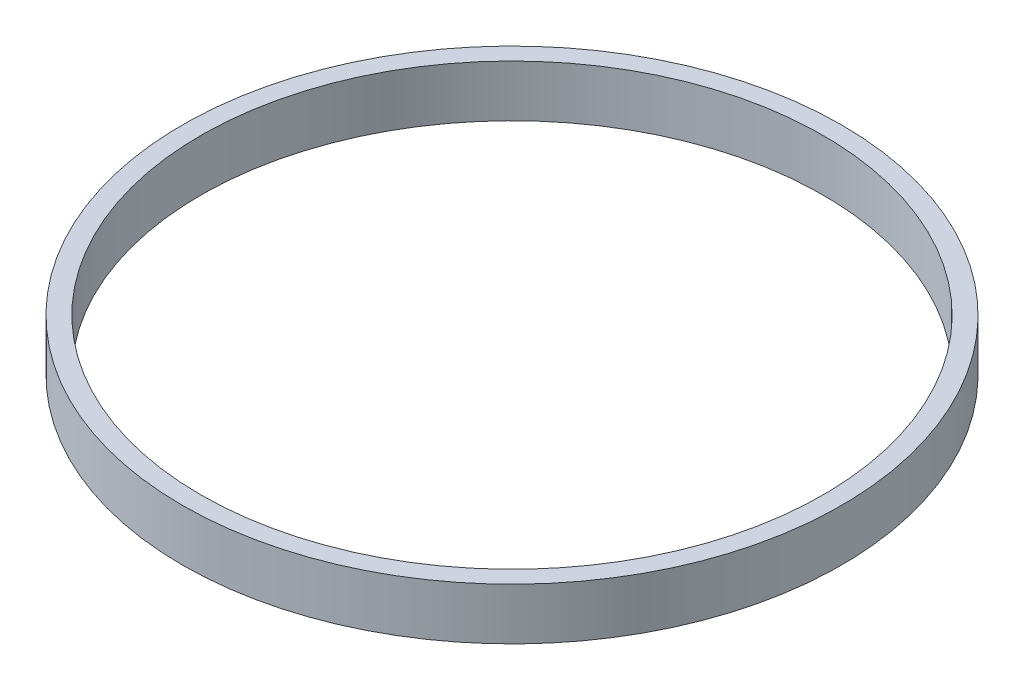
ISO-10303-21;
HEADER;
FILE_DESCRIPTION(('STEP AP214'),'2;1');
FILE_NAME('part.step','',(''),(''),'','','');
FILE_SCHEMA(('AUTOMOTIVE_DESIGN { 1 0 10303 214 1 1 1 1 }'));
ENDSEC;
DATA;
#1=APPLICATION_CONTEXT('core data for automotive mechanical design processes');
#2=APPLICATION_PROTOCOL_DEFINITION('international standard','automotive_design',2000,#1);
#3=PRODUCT_CONTEXT('',#1,'mechanical');
#4=PRODUCT('Part','Part','',(#3));
#5=PRODUCT_RELATED_PRODUCT_CATEGORY('part','',(#4));
#6=PRODUCT_DEFINITION_FORMATION('','',#4);
#7=PRODUCT_DEFINITION_CONTEXT('part definition',#1,'design');
#8=PRODUCT_DEFINITION('design','',#6,#7);
#9=PRODUCT_DEFINITION_SHAPE('','',#8);
#10=(LENGTH_UNIT() NAMED_UNIT(*) SI_UNIT(.MILLI.,.METRE.));
#11=(NAMED_UNIT(*) PLANE_ANGLE_UNIT() SI_UNIT($,.RADIAN.));
#12=(NAMED_UNIT(*) SI_UNIT($,.STERADIAN.) SOLID_ANGLE_UNIT());
#13=UNCERTAINTY_MEASURE_WITH_UNIT(LENGTH_MEASURE(1.E-05),#10,'distance_accuracy_value','');
#14=(GEOMETRIC_REPRESENTATION_CONTEXT(3) GLOBAL_UNCERTAINTY_ASSIGNED_CONTEXT((#13)) GLOBAL_UNIT_ASSIGNED_CONTEXT((#10,
#11,#12)) REPRESENTATION_CONTEXT('',''));
#15=CARTESIAN_POINT('',(0.,0.,0.));
#16=DIRECTION('',(0.,0.,1.));
#17=DIRECTION('',(1.,0.,0.));
#18=AXIS2_PLACEMENT_3D('',#15,#16,#17);
#19=CARTESIAN_POINT('',(0.,5.65,0.));
#20=DIRECTION('',(0.,1.,0.));
#21=DIRECTION('',(0.,0.,1.));
#22=AXIS2_PLACEMENT_3D('',#19,#20,#21);
#23=PLANE('',#22);
#24=CARTESIAN_POINT('',(0.,5.65,0.));
#25=DIRECTION('',(0.,1.,0.));
#26=DIRECTION('',(0.,0.,1.));
#27=AXIS2_PLACEMENT_3D('',#24,#25,#26);
#28=CIRCLE('',#27,36.);
#29=CARTESIAN_POINT('',(0.,5.65,36.));
#30=VERTEX_POINT('',#29);
#31=EDGE_CURVE('E10',#30,#30,#28,.T.);
#32=ORIENTED_EDGE('',*,*,#31,.T.);
#33=EDGE_LOOP('',(#32));
#34=FACE_BOUND('',#33,.T.);
#35=CARTESIAN_POINT('',(0.,5.65,0.));
#36=DIRECTION('',(0.,1.,0.));
#37=DIRECTION('',(0.,0.,1.));
#38=AXIS2_PLACEMENT_3D('',#35,#36,#37);
#39=CIRCLE('',#38,34.);
#40=CARTESIAN_POINT('',(0.,5.65,34.));
#41=VERTEX_POINT('',#40);
#42=EDGE_CURVE('E46',#41,#41,#39,.T.);
#43=ORIENTED_EDGE('',*,*,#42,.F.);
#44=EDGE_LOOP('',(#43));
#45=FACE_BOUND('',#44,.T.);
#46=ADVANCED_FACE('F35',(#34,#45),#23,.T.);
#47=CARTESIAN_POINT('',(0.,0.,0.));
#48=DIRECTION('',(0.,1.,0.));
#49=DIRECTION('',(0.,0.,1.));
#50=AXIS2_PLACEMENT_3D('',#47,#48,#49);
#51=PLANE('',#50);
#52=CARTESIAN_POINT('',(0.,0.,0.));
#53=DIRECTION('',(0.,1.,0.));
#54=DIRECTION('',(0.,0.,1.));
#55=AXIS2_PLACEMENT_3D('',#52,#53,#54);
#56=CIRCLE('',#55,36.);
#57=CARTESIAN_POINT('',(0.,0.,36.));
#58=VERTEX_POINT('',#57);
#59=EDGE_CURVE('E39',#58,#58,#56,.T.);
#60=ORIENTED_EDGE('',*,*,#59,.F.);
#61=EDGE_LOOP('',(#60));
#62=FACE_BOUND('',#61,.T.);
#63=CARTESIAN_POINT('',(0.,0.,0.));
#64=DIRECTION('',(0.,1.,0.));
#65=DIRECTION('',(0.,0.,1.));
#66=AXIS2_PLACEMENT_3D('',#63,#64,#65);
#67=CIRCLE('',#66,34.);
#68=CARTESIAN_POINT('',(0.,0.,34.));
#69=VERTEX_POINT('',#68);
#70=EDGE_CURVE('E48',#69,#69,#67,.T.);
#71=ORIENTED_EDGE('',*,*,#70,.T.);
#72=EDGE_LOOP('',(#71));
#73=FACE_BOUND('',#72,.T.);
#74=ADVANCED_FACE('F58',(#62,#73),#51,.F.);
#75=CARTESIAN_POINT('',(0.,5.65,0.));
#76=DIRECTION('',(0.,-1.,0.));
#77=DIRECTION('',(0.,0.,-1.));
#78=AXIS2_PLACEMENT_3D('',#75,#76,#77);
#79=CYLINDRICAL_SURFACE('',#78,36.);
#80=ORIENTED_EDGE('',*,*,#31,.F.);
#81=EDGE_LOOP('',(#80));
#82=FACE_BOUND('',#81,.T.);
#83=ORIENTED_EDGE('',*,*,#59,.T.);
#84=EDGE_LOOP('',(#83));
#85=FACE_BOUND('',#84,.T.);
#86=ADVANCED_FACE('F37',(#82,#85),#79,.T.);
#87=CARTESIAN_POINT('',(0.,5.65,0.));
#88=DIRECTION('',(0.,-1.,0.));
#89=DIRECTION('',(0.,0.,-1.));
#90=AXIS2_PLACEMENT_3D('',#87,#88,#89);
#91=CYLINDRICAL_SURFACE('',#90,34.);
#92=ORIENTED_EDGE('',*,*,#42,.T.);
#93=EDGE_LOOP('',(#92));
#94=FACE_BOUND('',#93,.T.);
#95=ORIENTED_EDGE('',*,*,#70,.F.);
#96=EDGE_LOOP('',(#95));
#97=FACE_BOUND('',#96,.T.);
#98=ADVANCED_FACE('F54',(#94,#97),#91,.F.);
#99=CLOSED_SHELL('',(#46,#74,#86,#98));
#100=MANIFOLD_SOLID_BREP('B2',#99);
#101=ADVANCED_BREP_SHAPE_REPRESENTATION('',(#18,#100),#14);
#102=SHAPE_DEFINITION_REPRESENTATION(#9,#101);
ENDSEC;
END-ISO-10303-21;
